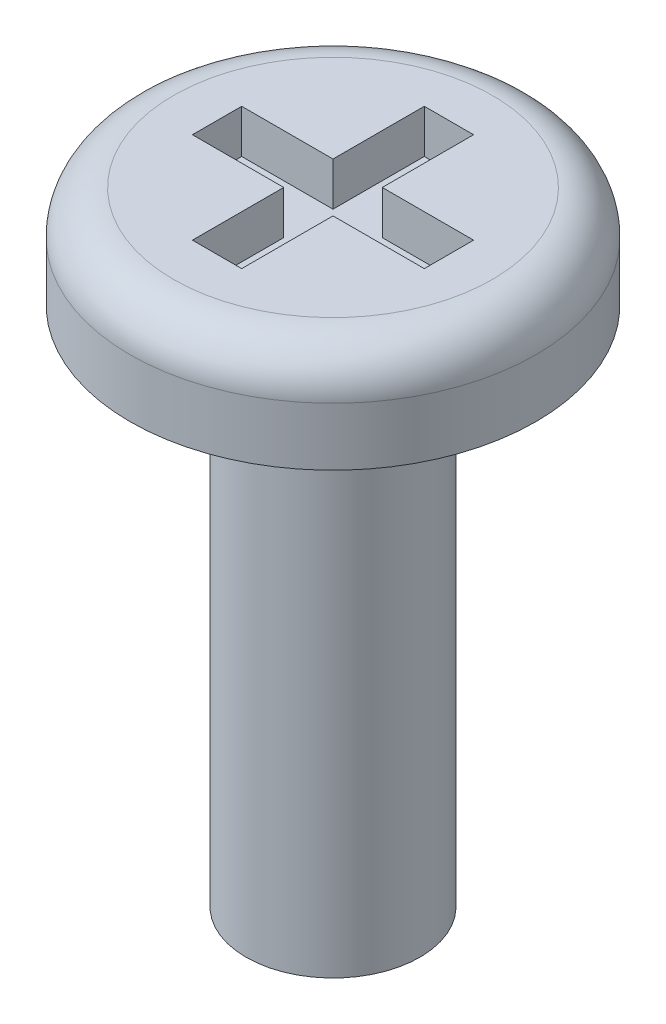
ISO-10303-21;
HEADER;
FILE_DESCRIPTION(('STEP AP214'),'2;1');
FILE_NAME('part.step','',(''),(''),'','','');
FILE_SCHEMA(('AUTOMOTIVE_DESIGN { 1 0 10303 214 1 1 1 1 }'));
ENDSEC;
DATA;
#1=APPLICATION_CONTEXT('core data for automotive mechanical design processes');
#2=APPLICATION_PROTOCOL_DEFINITION('international standard','automotive_design',2000,#1);
#3=PRODUCT_CONTEXT('',#1,'mechanical');
#4=PRODUCT('Part','Part','',(#3));
#5=PRODUCT_RELATED_PRODUCT_CATEGORY('part','',(#4));
#6=PRODUCT_DEFINITION_FORMATION('','',#4);
#7=PRODUCT_DEFINITION_CONTEXT('part definition',#1,'design');
#8=PRODUCT_DEFINITION('design','',#6,#7);
#9=PRODUCT_DEFINITION_SHAPE('','',#8);
#10=(LENGTH_UNIT() NAMED_UNIT(*) SI_UNIT(.MILLI.,.METRE.));
#11=(NAMED_UNIT(*) PLANE_ANGLE_UNIT() SI_UNIT($,.RADIAN.));
#12=(NAMED_UNIT(*) SI_UNIT($,.STERADIAN.) SOLID_ANGLE_UNIT());
#13=UNCERTAINTY_MEASURE_WITH_UNIT(LENGTH_MEASURE(1.E-05),#10,'distance_accuracy_value','');
#14=(GEOMETRIC_REPRESENTATION_CONTEXT(3) GLOBAL_UNCERTAINTY_ASSIGNED_CONTEXT((#13)) GLOBAL_UNIT_ASSIGNED_CONTEXT((#10,
#11,#12)) REPRESENTATION_CONTEXT('',''));
#15=CARTESIAN_POINT('',(0.,0.,0.));
#16=DIRECTION('',(0.,0.,1.));
#17=DIRECTION('',(1.,0.,0.));
#18=AXIS2_PLACEMENT_3D('',#15,#16,#17);
#19=CARTESIAN_POINT('',(0.,9.,0.));
#20=DIRECTION('',(0.,-1.,0.));
#21=DIRECTION('',(0.,0.,-1.));
#22=AXIS2_PLACEMENT_3D('',#19,#20,#21);
#23=CYLINDRICAL_SURFACE('',#22,1.5);
#24=CARTESIAN_POINT('',(0.,0.,0.));
#25=DIRECTION('',(0.,1.,0.));
#26=DIRECTION('',(0.,0.,1.));
#27=AXIS2_PLACEMENT_3D('',#24,#25,#26);
#28=CIRCLE('',#27,1.5);
#29=CARTESIAN_POINT('',(0.,0.,1.5));
#30=VERTEX_POINT('',#29);
#31=EDGE_CURVE('E213',#30,#30,#28,.T.);
#32=ORIENTED_EDGE('',*,*,#31,.T.);
#33=EDGE_LOOP('',(#32));
#34=FACE_BOUND('',#33,.T.);
#35=CARTESIAN_POINT('',(0.,8.,0.));
#36=DIRECTION('',(0.,1.,0.));
#37=DIRECTION('',(0.,0.,1.));
#38=AXIS2_PLACEMENT_3D('',#35,#36,#37);
#39=CIRCLE('',#38,1.5);
#40=CARTESIAN_POINT('',(0.,8.,1.5));
#41=VERTEX_POINT('',#40);
#42=EDGE_CURVE('E222',#41,#41,#39,.T.);
#43=ORIENTED_EDGE('',*,*,#42,.F.);
#44=EDGE_LOOP('',(#43));
#45=FACE_BOUND('',#44,.T.);
#46=ADVANCED_FACE('F37',(#34,#45),#23,.T.);
#47=CARTESIAN_POINT('',(0.,8.75,0.));
#48=DIRECTION('',(0.,1.,0.));
#49=DIRECTION('',(0.,0.,1.));
#50=AXIS2_PLACEMENT_3D('',#47,#48,#49);
#51=CIRCLE('',#50,1.5);
#52=CARTESIAN_POINT('',(0.,8.75,1.5));
#53=VERTEX_POINT('',#52);
#54=EDGE_CURVE('E11',#53,#53,#51,.F.);
#55=ORIENTED_EDGE('',*,*,#54,.T.);
#56=EDGE_LOOP('',(#55));
#57=FACE_BOUND('',#56,.T.);
#58=ORIENTED_EDGE('',*,*,#42,.T.);
#59=EDGE_LOOP('',(#58));
#60=FACE_BOUND('',#59,.T.);
#61=ADVANCED_FACE('F240',(#57,#60),#23,.T.);
#62=CARTESIAN_POINT('',(0.,0.,0.));
#63=DIRECTION('',(0.,1.,0.));
#64=DIRECTION('',(0.,0.,1.));
#65=AXIS2_PLACEMENT_3D('',#62,#63,#64);
#66=PLANE('',#65);
#67=ORIENTED_EDGE('',*,*,#31,.F.);
#68=EDGE_LOOP('',(#67));
#69=FACE_BOUND('',#68,.T.);
#70=ADVANCED_FACE('F246',(#69),#66,.F.);
#71=CARTESIAN_POINT('',(0.,10.75,0.));
#72=DIRECTION('',(0.,-1.,0.));
#73=DIRECTION('',(0.,0.,-1.));
#74=AXIS2_PLACEMENT_3D('',#71,#72,#73);
#75=CYLINDRICAL_SURFACE('',#74,3.5);
#76=CARTESIAN_POINT('',(0.,10.,0.));
#77=DIRECTION('',(0.,1.,0.));
#78=DIRECTION('',(0.,0.,1.));
#79=AXIS2_PLACEMENT_3D('',#76,#77,#78);
#80=CIRCLE('',#79,3.5);
#81=CARTESIAN_POINT('',(0.,10.,3.5));
#82=VERTEX_POINT('',#81);
#83=EDGE_CURVE('E219',#82,#82,#80,.F.);
#84=ORIENTED_EDGE('',*,*,#83,.T.);
#85=EDGE_LOOP('',(#84));
#86=FACE_BOUND('',#85,.T.);
#87=CARTESIAN_POINT('',(0.,9.,0.));
#88=DIRECTION('',(0.,1.,0.));
#89=DIRECTION('',(0.,0.,1.));
#90=AXIS2_PLACEMENT_3D('',#87,#88,#89);
#91=CIRCLE('',#90,3.5);
#92=CARTESIAN_POINT('',(0.,9.,3.5));
#93=VERTEX_POINT('',#92);
#94=EDGE_CURVE('E193',#93,#93,#91,.T.);
#95=ORIENTED_EDGE('',*,*,#94,.T.);
#96=EDGE_LOOP('',(#95));
#97=FACE_BOUND('',#96,.T.);
#98=ADVANCED_FACE('F268',(#86,#97),#75,.T.);
#99=CARTESIAN_POINT('',(0.,10.75,0.));
#100=DIRECTION('',(0.,1.,0.));
#101=DIRECTION('',(0.,0.,1.));
#102=AXIS2_PLACEMENT_3D('',#99,#100,#101);
#103=PLANE('',#102);
#104=DIRECTION('',(1.,0.,0.));
#105=VECTOR('',#104,1.);
#106=CARTESIAN_POINT('',(0.425,10.75,0.425));
#107=LINE('',#106,#105);
#108=CARTESIAN_POINT('',(0.425,10.75,0.425));
#109=VERTEX_POINT('',#108);
#110=CARTESIAN_POINT('',(2.,10.75,0.425));
#111=VERTEX_POINT('',#110);
#112=EDGE_CURVE('E52',#109,#111,#107,.T.);
#113=ORIENTED_EDGE('',*,*,#112,.F.);
#114=DIRECTION('',(0.,0.,-1.));
#115=VECTOR('',#114,1.);
#116=CARTESIAN_POINT('',(0.425,10.75,0.425));
#117=LINE('',#116,#115);
#118=CARTESIAN_POINT('',(0.425,10.75,2.));
#119=VERTEX_POINT('',#118);
#120=EDGE_CURVE('E189',#119,#109,#117,.T.);
#121=ORIENTED_EDGE('',*,*,#120,.F.);
#122=DIRECTION('',(1.,0.,0.));
#123=VECTOR('',#122,1.);
#124=CARTESIAN_POINT('',(-0.425,10.75,2.));
#125=LINE('',#124,#123);
#126=CARTESIAN_POINT('',(-0.425,10.75,2.));
#127=VERTEX_POINT('',#126);
#128=EDGE_CURVE('E187',#127,#119,#125,.T.);
#129=ORIENTED_EDGE('',*,*,#128,.F.);
#130=DIRECTION('',(0.,0.,1.));
#131=VECTOR('',#130,1.);
#132=CARTESIAN_POINT('',(-0.425,10.75,0.425));
#133=LINE('',#132,#131);
#134=CARTESIAN_POINT('',(-0.425,10.75,0.425));
#135=VERTEX_POINT('',#134);
#136=EDGE_CURVE('E136',#135,#127,#133,.T.);
#137=ORIENTED_EDGE('',*,*,#136,.F.);
#138=DIRECTION('',(1.,0.,0.));
#139=VECTOR('',#138,1.);
#140=CARTESIAN_POINT('',(-2.,10.75,0.425));
#141=LINE('',#140,#139);
#142=CARTESIAN_POINT('',(-2.,10.75,0.425));
#143=VERTEX_POINT('',#142);
#144=EDGE_CURVE('E183',#143,#135,#141,.T.);
#145=ORIENTED_EDGE('',*,*,#144,.F.);
#146=DIRECTION('',(0.,0.,1.));
#147=VECTOR('',#146,1.);
#148=CARTESIAN_POINT('',(-2.,10.75,-0.425));
#149=LINE('',#148,#147);
#150=CARTESIAN_POINT('',(-2.,10.75,-0.425));
#151=VERTEX_POINT('',#150);
#152=EDGE_CURVE('E180',#151,#143,#149,.T.);
#153=ORIENTED_EDGE('',*,*,#152,.F.);
#154=DIRECTION('',(-1.,0.,0.));
#155=VECTOR('',#154,1.);
#156=CARTESIAN_POINT('',(-2.,10.75,-0.425));
#157=LINE('',#156,#155);
#158=CARTESIAN_POINT('',(-0.425,10.75,-0.425));
#159=VERTEX_POINT('',#158);
#160=EDGE_CURVE('E177',#159,#151,#157,.T.);
#161=ORIENTED_EDGE('',*,*,#160,.F.);
#162=DIRECTION('',(0.,0.,1.));
#163=VECTOR('',#162,1.);
#164=CARTESIAN_POINT('',(-0.425,10.75,-2.));
#165=LINE('',#164,#163);
#166=CARTESIAN_POINT('',(-0.425,10.75,-2.));
#167=VERTEX_POINT('',#166);
#168=EDGE_CURVE('E174',#167,#159,#165,.T.);
#169=ORIENTED_EDGE('',*,*,#168,.F.);
#170=DIRECTION('',(-1.,0.,0.));
#171=VECTOR('',#170,1.);
#172=CARTESIAN_POINT('',(-0.425,10.75,-2.));
#173=LINE('',#172,#171);
#174=CARTESIAN_POINT('',(0.425,10.75,-2.));
#175=VERTEX_POINT('',#174);
#176=EDGE_CURVE('E171',#175,#167,#173,.T.);
#177=ORIENTED_EDGE('',*,*,#176,.F.);
#178=DIRECTION('',(0.,0.,-1.));
#179=VECTOR('',#178,1.);
#180=CARTESIAN_POINT('',(0.425,10.75,-2.));
#181=LINE('',#180,#179);
#182=CARTESIAN_POINT('',(0.425,10.75,-0.425));
#183=VERTEX_POINT('',#182);
#184=EDGE_CURVE('E168',#183,#175,#181,.T.);
#185=ORIENTED_EDGE('',*,*,#184,.F.);
#186=DIRECTION('',(-1.,0.,0.));
#187=VECTOR('',#186,1.);
#188=CARTESIAN_POINT('',(0.425,10.75,-0.425));
#189=LINE('',#188,#187);
#190=CARTESIAN_POINT('',(2.,10.75,-0.425));
#191=VERTEX_POINT('',#190);
#192=EDGE_CURVE('E165',#191,#183,#189,.T.);
#193=ORIENTED_EDGE('',*,*,#192,.F.);
#194=DIRECTION('',(0.,0.,-1.));
#195=VECTOR('',#194,1.);
#196=CARTESIAN_POINT('',(2.,10.75,-0.425));
#197=LINE('',#196,#195);
#198=EDGE_CURVE('E162',#111,#191,#197,.T.);
#199=ORIENTED_EDGE('',*,*,#198,.F.);
#200=EDGE_LOOP('',(#113,#121,#129,#137,#145,#153,#161,#169,#177,#185,#193,#199));
#201=FACE_BOUND('',#200,.T.);
#202=CARTESIAN_POINT('',(0.,10.75,0.));
#203=DIRECTION('',(0.,1.,0.));
#204=DIRECTION('',(0.,0.,1.));
#205=AXIS2_PLACEMENT_3D('',#202,#203,#204);
#206=CIRCLE('',#205,2.75);
#207=CARTESIAN_POINT('',(0.,10.75,2.75));
#208=VERTEX_POINT('',#207);
#209=EDGE_CURVE('E216',#208,#208,#206,.T.);
#210=ORIENTED_EDGE('',*,*,#209,.T.);
#211=EDGE_LOOP('',(#210));
#212=FACE_BOUND('',#211,.T.);
#213=ADVANCED_FACE('F261',(#201,#212),#103,.T.);
#214=CARTESIAN_POINT('',(0.,9.,0.));
#215=DIRECTION('',(0.,1.,0.));
#216=DIRECTION('',(0.,0.,1.));
#217=AXIS2_PLACEMENT_3D('',#214,#215,#216);
#218=PLANE('',#217);
#219=CARTESIAN_POINT('',(0.,9.,0.));
#220=DIRECTION('',(0.,1.,0.));
#221=DIRECTION('',(0.,0.,1.));
#222=AXIS2_PLACEMENT_3D('',#219,#220,#221);
#223=CIRCLE('',#222,1.75);
#224=CARTESIAN_POINT('',(0.,9.,1.75));
#225=VERTEX_POINT('',#224);
#226=EDGE_CURVE('E45',#225,#225,#223,.T.);
#227=ORIENTED_EDGE('',*,*,#226,.T.);
#228=EDGE_LOOP('',(#227));
#229=FACE_BOUND('',#228,.T.);
#230=ORIENTED_EDGE('',*,*,#94,.F.);
#231=EDGE_LOOP('',(#230));
#232=FACE_BOUND('',#231,.T.);
#233=ADVANCED_FACE('F228',(#229,#232),#218,.F.);
#234=CARTESIAN_POINT('',(0.,10.,0.));
#235=DIRECTION('',(0.,1.,0.));
#236=DIRECTION('',(0.,0.,1.));
#237=AXIS2_PLACEMENT_3D('',#234,#235,#236);
#238=TOROIDAL_SURFACE('',#237,2.75,0.75);
#239=ORIENTED_EDGE('',*,*,#83,.F.);
#240=EDGE_LOOP('',(#239));
#241=FACE_BOUND('',#240,.T.);
#242=ORIENTED_EDGE('',*,*,#209,.F.);
#243=EDGE_LOOP('',(#242));
#244=FACE_BOUND('',#243,.T.);
#245=ADVANCED_FACE('F251',(#241,#244),#238,.T.);
#246=CARTESIAN_POINT('',(0.425,10.,0.425));
#247=DIRECTION('',(0.,0.,1.));
#248=DIRECTION('',(1.,0.,0.));
#249=AXIS2_PLACEMENT_3D('',#246,#247,#248);
#250=PLANE('',#249);
#251=ORIENTED_EDGE('',*,*,#112,.T.);
#252=DIRECTION('',(0.,1.,0.));
#253=VECTOR('',#252,1.);
#254=CARTESIAN_POINT('',(2.,10.,0.425));
#255=LINE('',#254,#253);
#256=CARTESIAN_POINT('',(2.,10.,0.425));
#257=VERTEX_POINT('',#256);
#258=EDGE_CURVE('E100',#257,#111,#255,.T.);
#259=ORIENTED_EDGE('',*,*,#258,.F.);
#260=DIRECTION('',(1.,0.,0.));
#261=VECTOR('',#260,1.);
#262=CARTESIAN_POINT('',(0.425,10.,0.425));
#263=LINE('',#262,#261);
#264=CARTESIAN_POINT('',(0.425,10.,0.425));
#265=VERTEX_POINT('',#264);
#266=EDGE_CURVE('E191',#265,#257,#263,.T.);
#267=ORIENTED_EDGE('',*,*,#266,.F.);
#268=DIRECTION('',(0.,1.,0.));
#269=VECTOR('',#268,1.);
#270=CARTESIAN_POINT('',(0.425,10.,0.425));
#271=LINE('',#270,#269);
#272=EDGE_CURVE('E60',#265,#109,#271,.T.);
#273=ORIENTED_EDGE('',*,*,#272,.T.);
#274=EDGE_LOOP('',(#251,#259,#267,#273));
#275=FACE_BOUND('',#274,.T.);
#276=ADVANCED_FACE('F253',(#275),#250,.F.);
#277=CARTESIAN_POINT('',(0.425,10.,0.425));
#278=DIRECTION('',(1.,0.,0.));
#279=DIRECTION('',(0.,0.,-1.));
#280=AXIS2_PLACEMENT_3D('',#277,#278,#279);
#281=PLANE('',#280);
#282=ORIENTED_EDGE('',*,*,#120,.T.);
#283=ORIENTED_EDGE('',*,*,#272,.F.);
#284=DIRECTION('',(0.,0.,-1.));
#285=VECTOR('',#284,1.);
#286=CARTESIAN_POINT('',(0.425,10.,0.425));
#287=LINE('',#286,#285);
#288=CARTESIAN_POINT('',(0.425,10.,2.));
#289=VERTEX_POINT('',#288);
#290=EDGE_CURVE('E148',#289,#265,#287,.T.);
#291=ORIENTED_EDGE('',*,*,#290,.F.);
#292=DIRECTION('',(0.,1.,0.));
#293=VECTOR('',#292,1.);
#294=CARTESIAN_POINT('',(0.425,10.,2.));
#295=LINE('',#294,#293);
#296=EDGE_CURVE('E140',#289,#119,#295,.T.);
#297=ORIENTED_EDGE('',*,*,#296,.T.);
#298=EDGE_LOOP('',(#282,#283,#291,#297));
#299=FACE_BOUND('',#298,.T.);
#300=ADVANCED_FACE('F259',(#299),#281,.F.);
#301=CARTESIAN_POINT('',(-0.425,10.,2.));
#302=DIRECTION('',(0.,0.,1.));
#303=DIRECTION('',(1.,0.,0.));
#304=AXIS2_PLACEMENT_3D('',#301,#302,#303);
#305=PLANE('',#304);
#306=ORIENTED_EDGE('',*,*,#128,.T.);
#307=ORIENTED_EDGE('',*,*,#296,.F.);
#308=DIRECTION('',(1.,0.,0.));
#309=VECTOR('',#308,1.);
#310=CARTESIAN_POINT('',(-0.425,10.,2.));
#311=LINE('',#310,#309);
#312=CARTESIAN_POINT('',(-0.425,10.,2.));
#313=VERTEX_POINT('',#312);
#314=EDGE_CURVE('E144',#313,#289,#311,.T.);
#315=ORIENTED_EDGE('',*,*,#314,.F.);
#316=DIRECTION('',(0.,1.,0.));
#317=VECTOR('',#316,1.);
#318=CARTESIAN_POINT('',(-0.425,10.,2.));
#319=LINE('',#318,#317);
#320=EDGE_CURVE('E129',#313,#127,#319,.T.);
#321=ORIENTED_EDGE('',*,*,#320,.T.);
#322=EDGE_LOOP('',(#306,#307,#315,#321));
#323=FACE_BOUND('',#322,.T.);
#324=ADVANCED_FACE('F145',(#323),#305,.F.);
#325=CARTESIAN_POINT('',(-0.425,10.,0.425));
#326=DIRECTION('',(-1.,0.,0.));
#327=DIRECTION('',(0.,0.,1.));
#328=AXIS2_PLACEMENT_3D('',#325,#326,#327);
#329=PLANE('',#328);
#330=ORIENTED_EDGE('',*,*,#136,.T.);
#331=ORIENTED_EDGE('',*,*,#320,.F.);
#332=DIRECTION('',(0.,0.,1.));
#333=VECTOR('',#332,1.);
#334=CARTESIAN_POINT('',(-0.425,10.,0.425));
#335=LINE('',#334,#333);
#336=CARTESIAN_POINT('',(-0.425,10.,0.425));
#337=VERTEX_POINT('',#336);
#338=EDGE_CURVE('E133',#337,#313,#335,.T.);
#339=ORIENTED_EDGE('',*,*,#338,.F.);
#340=DIRECTION('',(0.,1.,0.));
#341=VECTOR('',#340,1.);
#342=CARTESIAN_POINT('',(-0.425,10.,0.425));
#343=LINE('',#342,#341);
#344=EDGE_CURVE('E141',#337,#135,#343,.T.);
#345=ORIENTED_EDGE('',*,*,#344,.T.);
#346=EDGE_LOOP('',(#330,#331,#339,#345));
#347=FACE_BOUND('',#346,.T.);
#348=ADVANCED_FACE('F131',(#347),#329,.F.);
#349=CARTESIAN_POINT('',(-2.,10.,0.425));
#350=DIRECTION('',(0.,0.,1.));
#351=DIRECTION('',(1.,0.,0.));
#352=AXIS2_PLACEMENT_3D('',#349,#350,#351);
#353=PLANE('',#352);
#354=ORIENTED_EDGE('',*,*,#144,.T.);
#355=ORIENTED_EDGE('',*,*,#344,.F.);
#356=DIRECTION('',(1.,0.,0.));
#357=VECTOR('',#356,1.);
#358=CARTESIAN_POINT('',(-2.,10.,0.425));
#359=LINE('',#358,#357);
#360=CARTESIAN_POINT('',(-2.,10.,0.425));
#361=VERTEX_POINT('',#360);
#362=EDGE_CURVE('E154',#361,#337,#359,.T.);
#363=ORIENTED_EDGE('',*,*,#362,.F.);
#364=DIRECTION('',(0.,1.,0.));
#365=VECTOR('',#364,1.);
#366=CARTESIAN_POINT('',(-2.,10.,0.425));
#367=LINE('',#366,#365);
#368=EDGE_CURVE('E196',#361,#143,#367,.T.);
#369=ORIENTED_EDGE('',*,*,#368,.T.);
#370=EDGE_LOOP('',(#354,#355,#363,#369));
#371=FACE_BOUND('',#370,.T.);
#372=ADVANCED_FACE('F302',(#371),#353,.F.);
#373=CARTESIAN_POINT('',(-2.,10.,-0.425));
#374=DIRECTION('',(-1.,0.,0.));
#375=DIRECTION('',(0.,0.,1.));
#376=AXIS2_PLACEMENT_3D('',#373,#374,#375);
#377=PLANE('',#376);
#378=ORIENTED_EDGE('',*,*,#152,.T.);
#379=ORIENTED_EDGE('',*,*,#368,.F.);
#380=DIRECTION('',(0.,0.,1.));
#381=VECTOR('',#380,1.);
#382=CARTESIAN_POINT('',(-2.,10.,-0.425));
#383=LINE('',#382,#381);
#384=CARTESIAN_POINT('',(-2.,10.,-0.425));
#385=VERTEX_POINT('',#384);
#386=EDGE_CURVE('E156',#385,#361,#383,.T.);
#387=ORIENTED_EDGE('',*,*,#386,.F.);
#388=DIRECTION('',(0.,1.,0.));
#389=VECTOR('',#388,1.);
#390=CARTESIAN_POINT('',(-2.,10.,-0.425));
#391=LINE('',#390,#389);
#392=EDGE_CURVE('E198',#385,#151,#391,.T.);
#393=ORIENTED_EDGE('',*,*,#392,.T.);
#394=EDGE_LOOP('',(#378,#379,#387,#393));
#395=FACE_BOUND('',#394,.T.);
#396=ADVANCED_FACE('F298',(#395),#377,.F.);
#397=CARTESIAN_POINT('',(-2.,10.,-0.425));
#398=DIRECTION('',(0.,0.,-1.));
#399=DIRECTION('',(-1.,0.,0.));
#400=AXIS2_PLACEMENT_3D('',#397,#398,#399);
#401=PLANE('',#400);
#402=ORIENTED_EDGE('',*,*,#160,.T.);
#403=ORIENTED_EDGE('',*,*,#392,.F.);
#404=DIRECTION('',(-1.,0.,0.));
#405=VECTOR('',#404,1.);
#406=CARTESIAN_POINT('',(-2.,10.,-0.425));
#407=LINE('',#406,#405);
#408=CARTESIAN_POINT('',(-0.425,10.,-0.425));
#409=VERTEX_POINT('',#408);
#410=EDGE_CURVE('E336',#409,#385,#407,.T.);
#411=ORIENTED_EDGE('',*,*,#410,.F.);
#412=DIRECTION('',(0.,1.,0.));
#413=VECTOR('',#412,1.);
#414=CARTESIAN_POINT('',(-0.425,10.,-0.425));
#415=LINE('',#414,#413);
#416=EDGE_CURVE('E200',#409,#159,#415,.T.);
#417=ORIENTED_EDGE('',*,*,#416,.T.);
#418=EDGE_LOOP('',(#402,#403,#411,#417));
#419=FACE_BOUND('',#418,.T.);
#420=ADVANCED_FACE('F294',(#419),#401,.F.);
#421=CARTESIAN_POINT('',(-0.425,10.,-2.));
#422=DIRECTION('',(-1.,0.,0.));
#423=DIRECTION('',(0.,0.,1.));
#424=AXIS2_PLACEMENT_3D('',#421,#422,#423);
#425=PLANE('',#424);
#426=ORIENTED_EDGE('',*,*,#168,.T.);
#427=ORIENTED_EDGE('',*,*,#416,.F.);
#428=DIRECTION('',(0.,0.,1.));
#429=VECTOR('',#428,1.);
#430=CARTESIAN_POINT('',(-0.425,10.,-2.));
#431=LINE('',#430,#429);
#432=CARTESIAN_POINT('',(-0.425,10.,-2.));
#433=VERTEX_POINT('',#432);
#434=EDGE_CURVE('E333',#433,#409,#431,.T.);
#435=ORIENTED_EDGE('',*,*,#434,.F.);
#436=DIRECTION('',(0.,1.,0.));
#437=VECTOR('',#436,1.);
#438=CARTESIAN_POINT('',(-0.425,10.,-2.));
#439=LINE('',#438,#437);
#440=EDGE_CURVE('E202',#433,#167,#439,.T.);
#441=ORIENTED_EDGE('',*,*,#440,.T.);
#442=EDGE_LOOP('',(#426,#427,#435,#441));
#443=FACE_BOUND('',#442,.T.);
#444=ADVANCED_FACE('F290',(#443),#425,.F.);
#445=CARTESIAN_POINT('',(-0.425,10.,-2.));
#446=DIRECTION('',(0.,0.,-1.));
#447=DIRECTION('',(-1.,0.,0.));
#448=AXIS2_PLACEMENT_3D('',#445,#446,#447);
#449=PLANE('',#448);
#450=ORIENTED_EDGE('',*,*,#176,.T.);
#451=ORIENTED_EDGE('',*,*,#440,.F.);
#452=DIRECTION('',(-1.,0.,0.));
#453=VECTOR('',#452,1.);
#454=CARTESIAN_POINT('',(-0.425,10.,-2.));
#455=LINE('',#454,#453);
#456=CARTESIAN_POINT('',(0.425,10.,-2.));
#457=VERTEX_POINT('',#456);
#458=EDGE_CURVE('E330',#457,#433,#455,.T.);
#459=ORIENTED_EDGE('',*,*,#458,.F.);
#460=DIRECTION('',(0.,1.,0.));
#461=VECTOR('',#460,1.);
#462=CARTESIAN_POINT('',(0.425,10.,-2.));
#463=LINE('',#462,#461);
#464=EDGE_CURVE('E204',#457,#175,#463,.T.);
#465=ORIENTED_EDGE('',*,*,#464,.T.);
#466=EDGE_LOOP('',(#450,#451,#459,#465));
#467=FACE_BOUND('',#466,.T.);
#468=ADVANCED_FACE('F286',(#467),#449,.F.);
#469=CARTESIAN_POINT('',(0.425,10.,-2.));
#470=DIRECTION('',(1.,0.,0.));
#471=DIRECTION('',(0.,0.,-1.));
#472=AXIS2_PLACEMENT_3D('',#469,#470,#471);
#473=PLANE('',#472);
#474=ORIENTED_EDGE('',*,*,#184,.T.);
#475=ORIENTED_EDGE('',*,*,#464,.F.);
#476=DIRECTION('',(0.,0.,-1.));
#477=VECTOR('',#476,1.);
#478=CARTESIAN_POINT('',(0.425,10.,-2.));
#479=LINE('',#478,#477);
#480=CARTESIAN_POINT('',(0.425,10.,-0.425));
#481=VERTEX_POINT('',#480);
#482=EDGE_CURVE('E327',#481,#457,#479,.T.);
#483=ORIENTED_EDGE('',*,*,#482,.F.);
#484=DIRECTION('',(0.,1.,0.));
#485=VECTOR('',#484,1.);
#486=CARTESIAN_POINT('',(0.425,10.,-0.425));
#487=LINE('',#486,#485);
#488=EDGE_CURVE('E206',#481,#183,#487,.T.);
#489=ORIENTED_EDGE('',*,*,#488,.T.);
#490=EDGE_LOOP('',(#474,#475,#483,#489));
#491=FACE_BOUND('',#490,.T.);
#492=ADVANCED_FACE('F282',(#491),#473,.F.);
#493=CARTESIAN_POINT('',(0.425,10.,-0.425));
#494=DIRECTION('',(0.,0.,-1.));
#495=DIRECTION('',(-1.,0.,0.));
#496=AXIS2_PLACEMENT_3D('',#493,#494,#495);
#497=PLANE('',#496);
#498=ORIENTED_EDGE('',*,*,#192,.T.);
#499=ORIENTED_EDGE('',*,*,#488,.F.);
#500=DIRECTION('',(-1.,0.,0.));
#501=VECTOR('',#500,1.);
#502=CARTESIAN_POINT('',(0.425,10.,-0.425));
#503=LINE('',#502,#501);
#504=CARTESIAN_POINT('',(2.,10.,-0.425));
#505=VERTEX_POINT('',#504);
#506=EDGE_CURVE('E322',#505,#481,#503,.T.);
#507=ORIENTED_EDGE('',*,*,#506,.F.);
#508=DIRECTION('',(0.,1.,0.));
#509=VECTOR('',#508,1.);
#510=CARTESIAN_POINT('',(2.,10.,-0.425));
#511=LINE('',#510,#509);
#512=EDGE_CURVE('E208',#505,#191,#511,.T.);
#513=ORIENTED_EDGE('',*,*,#512,.T.);
#514=EDGE_LOOP('',(#498,#499,#507,#513));
#515=FACE_BOUND('',#514,.T.);
#516=ADVANCED_FACE('F278',(#515),#497,.F.);
#517=CARTESIAN_POINT('',(2.,10.,-0.425));
#518=DIRECTION('',(1.,0.,0.));
#519=DIRECTION('',(0.,0.,-1.));
#520=AXIS2_PLACEMENT_3D('',#517,#518,#519);
#521=PLANE('',#520);
#522=ORIENTED_EDGE('',*,*,#198,.T.);
#523=ORIENTED_EDGE('',*,*,#512,.F.);
#524=DIRECTION('',(0.,0.,-1.));
#525=VECTOR('',#524,1.);
#526=CARTESIAN_POINT('',(2.,10.,-0.425));
#527=LINE('',#526,#525);
#528=EDGE_CURVE('E320',#257,#505,#527,.T.);
#529=ORIENTED_EDGE('',*,*,#528,.F.);
#530=ORIENTED_EDGE('',*,*,#258,.T.);
#531=EDGE_LOOP('',(#522,#523,#529,#530));
#532=FACE_BOUND('',#531,.T.);
#533=ADVANCED_FACE('F236',(#532),#521,.F.);
#534=CARTESIAN_POINT('',(0.,10.,0.));
#535=DIRECTION('',(0.,-1.,0.));
#536=DIRECTION('',(0.,0.,-1.));
#537=AXIS2_PLACEMENT_3D('',#534,#535,#536);
#538=PLANE('',#537);
#539=ORIENTED_EDGE('',*,*,#266,.T.);
#540=ORIENTED_EDGE('',*,*,#528,.T.);
#541=ORIENTED_EDGE('',*,*,#506,.T.);
#542=ORIENTED_EDGE('',*,*,#482,.T.);
#543=ORIENTED_EDGE('',*,*,#458,.T.);
#544=ORIENTED_EDGE('',*,*,#434,.T.);
#545=ORIENTED_EDGE('',*,*,#410,.T.);
#546=ORIENTED_EDGE('',*,*,#386,.T.);
#547=ORIENTED_EDGE('',*,*,#362,.T.);
#548=ORIENTED_EDGE('',*,*,#338,.T.);
#549=ORIENTED_EDGE('',*,*,#314,.T.);
#550=ORIENTED_EDGE('',*,*,#290,.T.);
#551=EDGE_LOOP('',(#539,#540,#541,#542,#543,#544,#545,#546,#547,#548,#549,#550));
#552=FACE_BOUND('',#551,.T.);
#553=ADVANCED_FACE('F151',(#552),#538,.F.);
#554=CARTESIAN_POINT('',(0.,8.75,0.));
#555=DIRECTION('',(0.,1.,0.));
#556=DIRECTION('',(0.,0.,1.));
#557=AXIS2_PLACEMENT_3D('',#554,#555,#556);
#558=TOROIDAL_SURFACE('',#557,1.75,0.25);
#559=ORIENTED_EDGE('',*,*,#54,.F.);
#560=EDGE_LOOP('',(#559));
#561=FACE_BOUND('',#560,.T.);
#562=ORIENTED_EDGE('',*,*,#226,.F.);
#563=EDGE_LOOP('',(#562));
#564=FACE_BOUND('',#563,.T.);
#565=ADVANCED_FACE('F39',(#561,#564),#558,.F.);
#566=CLOSED_SHELL('',(#46,#61,#70,#98,#213,#233,#245,#276,#300,#324,#348,#372,#396,#420,#444,
#468,#492,#516,#533,#553,#565));
#567=MANIFOLD_SOLID_BREP('B2',#566);
#568=ADVANCED_BREP_SHAPE_REPRESENTATION('',(#18,#567),#14);
#569=SHAPE_DEFINITION_REPRESENTATION(#9,#568);
ENDSEC;
END-ISO-10303-21;
